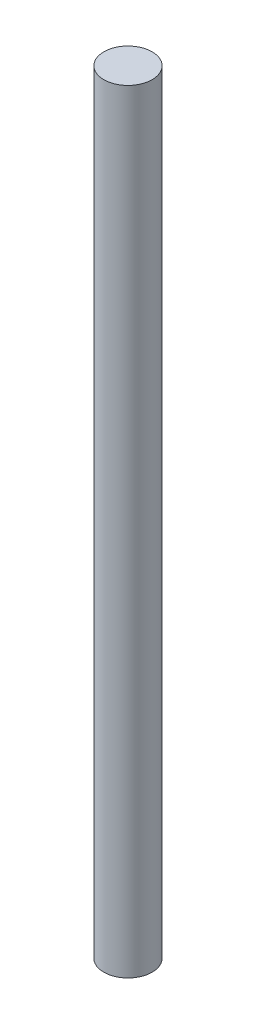
ISO-10303-21;
HEADER;
FILE_DESCRIPTION(('STEP AP214'),'2;1');
FILE_NAME('part.step','',(''),(''),'','','');
FILE_SCHEMA(('AUTOMOTIVE_DESIGN { 1 0 10303 214 1 1 1 1 }'));
ENDSEC;
DATA;
#1=APPLICATION_CONTEXT('core data for automotive mechanical design processes');
#2=APPLICATION_PROTOCOL_DEFINITION('international standard','automotive_design',2000,#1);
#3=PRODUCT_CONTEXT('',#1,'mechanical');
#4=PRODUCT('Part','Part','',(#3));
#5=PRODUCT_RELATED_PRODUCT_CATEGORY('part','',(#4));
#6=PRODUCT_DEFINITION_FORMATION('','',#4);
#7=PRODUCT_DEFINITION_CONTEXT('part definition',#1,'design');
#8=PRODUCT_DEFINITION('design','',#6,#7);
#9=PRODUCT_DEFINITION_SHAPE('','',#8);
#10=(LENGTH_UNIT() NAMED_UNIT(*) SI_UNIT(.MILLI.,.METRE.));
#11=(NAMED_UNIT(*) PLANE_ANGLE_UNIT() SI_UNIT($,.RADIAN.));
#12=(NAMED_UNIT(*) SI_UNIT($,.STERADIAN.) SOLID_ANGLE_UNIT());
#13=UNCERTAINTY_MEASURE_WITH_UNIT(LENGTH_MEASURE(1.E-05),#10,'distance_accuracy_value','');
#14=(GEOMETRIC_REPRESENTATION_CONTEXT(3) GLOBAL_UNCERTAINTY_ASSIGNED_CONTEXT((#13)) GLOBAL_UNIT_ASSIGNED_CONTEXT((#10,
#11,#12)) REPRESENTATION_CONTEXT('',''));
#15=CARTESIAN_POINT('',(0.,0.,0.));
#16=DIRECTION('',(0.,0.,1.));
#17=DIRECTION('',(1.,0.,0.));
#18=AXIS2_PLACEMENT_3D('',#15,#16,#17);
#19=CARTESIAN_POINT('',(0.,48.,0.));
#20=DIRECTION('',(0.,-1.,0.));
#21=DIRECTION('',(0.,0.,-1.));
#22=AXIS2_PLACEMENT_3D('',#19,#20,#21);
#23=CYLINDRICAL_SURFACE('',#22,1.5);
#24=CARTESIAN_POINT('',(0.,48.,0.));
#25=DIRECTION('',(0.,1.,0.));
#26=DIRECTION('',(0.,0.,1.));
#27=AXIS2_PLACEMENT_3D('',#24,#25,#26);
#28=CIRCLE('',#27,1.5);
#29=CARTESIAN_POINT('',(0.,48.,1.5));
#30=VERTEX_POINT('',#29);
#31=EDGE_CURVE('E10',#30,#30,#28,.T.);
#32=ORIENTED_EDGE('',*,*,#31,.F.);
#33=EDGE_LOOP('',(#32));
#34=FACE_BOUND('',#33,.T.);
#35=CARTESIAN_POINT('',(0.,0.,0.));
#36=DIRECTION('',(0.,1.,0.));
#37=DIRECTION('',(0.,0.,1.));
#38=AXIS2_PLACEMENT_3D('',#35,#36,#37);
#39=CIRCLE('',#38,1.5);
#40=CARTESIAN_POINT('',(0.,0.,1.5));
#41=VERTEX_POINT('',#40);
#42=EDGE_CURVE('E38',#41,#41,#39,.T.);
#43=ORIENTED_EDGE('',*,*,#42,.T.);
#44=EDGE_LOOP('',(#43));
#45=FACE_BOUND('',#44,.T.);
#46=ADVANCED_FACE('F35',(#34,#45),#23,.T.);
#47=CARTESIAN_POINT('',(0.,48.,0.));
#48=DIRECTION('',(0.,1.,0.));
#49=DIRECTION('',(0.,0.,1.));
#50=AXIS2_PLACEMENT_3D('',#47,#48,#49);
#51=PLANE('',#50);
#52=ORIENTED_EDGE('',*,*,#31,.T.);
#53=EDGE_LOOP('',(#52));
#54=FACE_BOUND('',#53,.T.);
#55=ADVANCED_FACE('F50',(#54),#51,.T.);
#56=CARTESIAN_POINT('',(0.,0.,0.));
#57=DIRECTION('',(0.,1.,0.));
#58=DIRECTION('',(0.,0.,1.));
#59=AXIS2_PLACEMENT_3D('',#56,#57,#58);
#60=PLANE('',#59);
#61=ORIENTED_EDGE('',*,*,#42,.F.);
#62=EDGE_LOOP('',(#61));
#63=FACE_BOUND('',#62,.T.);
#64=ADVANCED_FACE('F48',(#63),#60,.F.);
#65=CLOSED_SHELL('',(#46,#55,#64));
#66=MANIFOLD_SOLID_BREP('B2',#65);
#67=ADVANCED_BREP_SHAPE_REPRESENTATION('',(#18,#66),#14);
#68=SHAPE_DEFINITION_REPRESENTATION(#9,#67);
ENDSEC;
END-ISO-10303-21;
